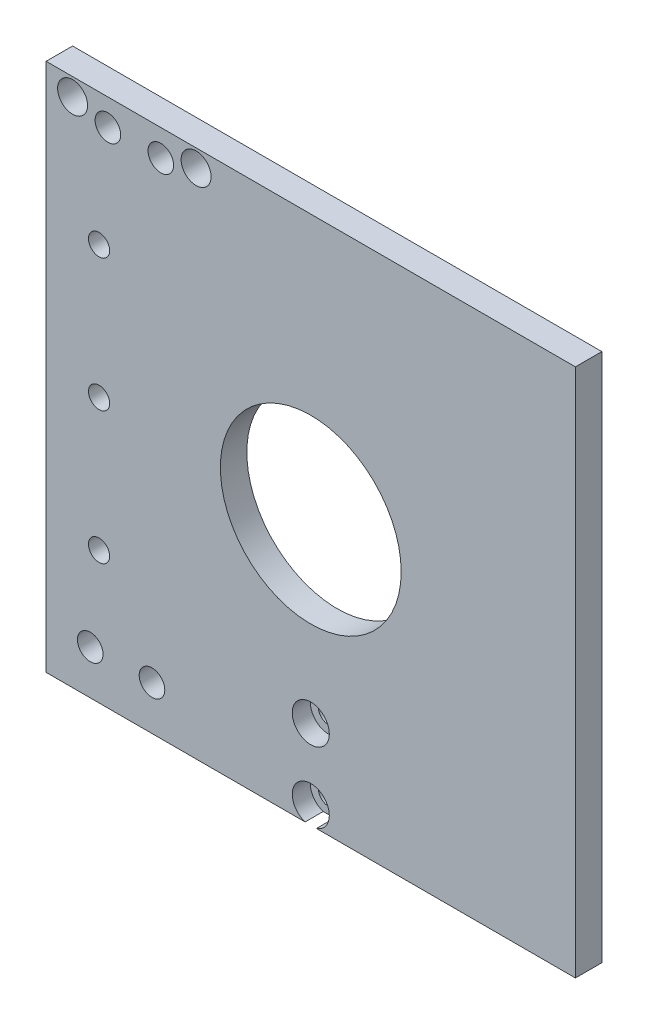
ISO-10303-21;
HEADER;
FILE_DESCRIPTION(('STEP AP214'),'2;1');
FILE_NAME('part.step','',(''),(''),'','','');
FILE_SCHEMA(('AUTOMOTIVE_DESIGN { 1 0 10303 214 1 1 1 1 }'));
ENDSEC;
DATA;
#1=APPLICATION_CONTEXT('core data for automotive mechanical design processes');
#2=APPLICATION_PROTOCOL_DEFINITION('international standard','automotive_design',2000,#1);
#3=PRODUCT_CONTEXT('',#1,'mechanical');
#4=PRODUCT('Part','Part','',(#3));
#5=PRODUCT_RELATED_PRODUCT_CATEGORY('part','',(#4));
#6=PRODUCT_DEFINITION_FORMATION('','',#4);
#7=PRODUCT_DEFINITION_CONTEXT('part definition',#1,'design');
#8=PRODUCT_DEFINITION('design','',#6,#7);
#9=PRODUCT_DEFINITION_SHAPE('','',#8);
#10=(LENGTH_UNIT() NAMED_UNIT(*) SI_UNIT(.MILLI.,.METRE.));
#11=(NAMED_UNIT(*) PLANE_ANGLE_UNIT() SI_UNIT($,.RADIAN.));
#12=(NAMED_UNIT(*) SI_UNIT($,.STERADIAN.) SOLID_ANGLE_UNIT());
#13=UNCERTAINTY_MEASURE_WITH_UNIT(LENGTH_MEASURE(1.E-05),#10,'distance_accuracy_value','');
#14=(GEOMETRIC_REPRESENTATION_CONTEXT(3) GLOBAL_UNCERTAINTY_ASSIGNED_CONTEXT((#13)) GLOBAL_UNIT_ASSIGNED_CONTEXT((#10,
#11,#12)) REPRESENTATION_CONTEXT('',''));
#15=CARTESIAN_POINT('',(0.,0.,0.));
#16=DIRECTION('',(0.,0.,1.));
#17=DIRECTION('',(1.,0.,0.));
#18=AXIS2_PLACEMENT_3D('',#15,#16,#17);
#19=CARTESIAN_POINT('',(1.11022302462516E-13,-20.,-0.01));
#20=DIRECTION('',(0.,0.,1.));
#21=DIRECTION('',(1.,0.,0.));
#22=AXIS2_PLACEMENT_3D('',#19,#20,#21);
#23=CYLINDRICAL_SURFACE('',#22,1.2);
#24=CARTESIAN_POINT('',(1.11022302462516E-13,-20.,0.));
#25=DIRECTION('',(0.,0.,1.));
#26=DIRECTION('',(1.,0.,0.));
#27=AXIS2_PLACEMENT_3D('',#24,#25,#26);
#28=CIRCLE('',#27,1.2);
#29=CARTESIAN_POINT('',(1.20000000000011,-20.,0.));
#30=VERTEX_POINT('',#29);
#31=EDGE_CURVE('E112',#30,#30,#28,.T.);
#32=ORIENTED_EDGE('',*,*,#31,.F.);
#33=EDGE_LOOP('',(#32));
#34=FACE_BOUND('',#33,.T.);
#35=CARTESIAN_POINT('',(1.11022302462516E-13,-20.,0.95));
#36=DIRECTION('',(0.,0.,1.));
#37=DIRECTION('',(1.,0.,0.));
#38=AXIS2_PLACEMENT_3D('',#35,#36,#37);
#39=CIRCLE('',#38,1.2);
#40=CARTESIAN_POINT('',(1.20000000000011,-20.,0.95));
#41=VERTEX_POINT('',#40);
#42=EDGE_CURVE('E161',#41,#41,#39,.F.);
#43=ORIENTED_EDGE('',*,*,#42,.F.);
#44=EDGE_LOOP('',(#43));
#45=FACE_BOUND('',#44,.T.);
#46=ADVANCED_FACE('F37',(#34,#45),#23,.F.);
#47=CARTESIAN_POINT('',(1.11022302462516E-13,-28.,-0.01));
#48=DIRECTION('',(0.,0.,1.));
#49=DIRECTION('',(1.,0.,0.));
#50=AXIS2_PLACEMENT_3D('',#47,#48,#49);
#51=CYLINDRICAL_SURFACE('',#50,1.2);
#52=CARTESIAN_POINT('',(1.11022302462516E-13,-28.,0.));
#53=DIRECTION('',(0.,0.,1.));
#54=DIRECTION('',(1.,0.,0.));
#55=AXIS2_PLACEMENT_3D('',#52,#53,#54);
#56=CIRCLE('',#55,1.2);
#57=CARTESIAN_POINT('',(1.20000000000011,-28.,0.));
#58=VERTEX_POINT('',#57);
#59=EDGE_CURVE('E156',#58,#58,#56,.T.);
#60=ORIENTED_EDGE('',*,*,#59,.F.);
#61=EDGE_LOOP('',(#60));
#62=FACE_BOUND('',#61,.T.);
#63=CARTESIAN_POINT('',(1.11022302462516E-13,-28.,0.95));
#64=DIRECTION('',(0.,0.,1.));
#65=DIRECTION('',(1.,0.,0.));
#66=AXIS2_PLACEMENT_3D('',#63,#64,#65);
#67=CIRCLE('',#66,1.2);
#68=CARTESIAN_POINT('',(1.20000000000011,-28.,0.95));
#69=VERTEX_POINT('',#68);
#70=EDGE_CURVE('E164',#69,#69,#67,.F.);
#71=ORIENTED_EDGE('',*,*,#70,.F.);
#72=EDGE_LOOP('',(#71));
#73=FACE_BOUND('',#72,.T.);
#74=ADVANCED_FACE('F244',(#62,#73),#51,.F.);
#75=CARTESIAN_POINT('',(-30.,-30.,3.));
#76=DIRECTION('',(1.,0.,0.));
#77=DIRECTION('',(0.,0.,-1.));
#78=AXIS2_PLACEMENT_3D('',#75,#76,#77);
#79=PLANE('',#78);
#80=DIRECTION('',(0.,-1.,0.));
#81=VECTOR('',#80,1.);
#82=CARTESIAN_POINT('',(-30.,-30.,0.));
#83=LINE('',#82,#81);
#84=CARTESIAN_POINT('',(-30.,30.,0.));
#85=VERTEX_POINT('',#84);
#86=CARTESIAN_POINT('',(-30.,-30.,0.));
#87=VERTEX_POINT('',#86);
#88=EDGE_CURVE('E132',#85,#87,#83,.T.);
#89=ORIENTED_EDGE('',*,*,#88,.T.);
#90=DIRECTION('',(0.,0.,-1.));
#91=VECTOR('',#90,1.);
#92=CARTESIAN_POINT('',(-30.,-30.,3.));
#93=LINE('',#92,#91);
#94=CARTESIAN_POINT('',(-30.,-30.,3.));
#95=VERTEX_POINT('',#94);
#96=EDGE_CURVE('E11',#95,#87,#93,.T.);
#97=ORIENTED_EDGE('',*,*,#96,.F.);
#98=DIRECTION('',(0.,-1.,0.));
#99=VECTOR('',#98,1.);
#100=CARTESIAN_POINT('',(-30.,-30.,3.));
#101=LINE('',#100,#99);
#102=CARTESIAN_POINT('',(-30.,30.,3.));
#103=VERTEX_POINT('',#102);
#104=EDGE_CURVE('E119',#103,#95,#101,.T.);
#105=ORIENTED_EDGE('',*,*,#104,.F.);
#106=DIRECTION('',(0.,0.,-1.));
#107=VECTOR('',#106,1.);
#108=CARTESIAN_POINT('',(-30.,30.,3.));
#109=LINE('',#108,#107);
#110=EDGE_CURVE('E129',#103,#85,#109,.T.);
#111=ORIENTED_EDGE('',*,*,#110,.T.);
#112=EDGE_LOOP('',(#89,#97,#105,#111));
#113=FACE_BOUND('',#112,.T.);
#114=ADVANCED_FACE('F45',(#113),#79,.F.);
#115=CARTESIAN_POINT('',(30.,-30.,3.));
#116=DIRECTION('',(0.,1.,0.));
#117=DIRECTION('',(-1.,0.,0.));
#118=AXIS2_PLACEMENT_3D('',#115,#116,#117);
#119=PLANE('',#118);
#120=DIRECTION('',(1.,0.,0.));
#121=VECTOR('',#120,1.);
#122=CARTESIAN_POINT('',(30.,-30.,0.95));
#123=LINE('',#122,#121);
#124=CARTESIAN_POINT('',(-0.640312423743276,-30.,0.95));
#125=VERTEX_POINT('',#124);
#126=CARTESIAN_POINT('',(0.640312423743498,-30.,0.95));
#127=VERTEX_POINT('',#126);
#128=EDGE_CURVE('E114',#125,#127,#123,.T.);
#129=ORIENTED_EDGE('',*,*,#128,.F.);
#130=DIRECTION('',(0.,0.,1.));
#131=VECTOR('',#130,1.);
#132=CARTESIAN_POINT('',(-0.640312423743276,-30.,0.95));
#133=LINE('',#132,#131);
#134=CARTESIAN_POINT('',(-0.640312423743276,-30.,3.));
#135=VERTEX_POINT('',#134);
#136=EDGE_CURVE('E108',#125,#135,#133,.T.);
#137=ORIENTED_EDGE('',*,*,#136,.T.);
#138=DIRECTION('',(1.,0.,0.));
#139=VECTOR('',#138,1.);
#140=CARTESIAN_POINT('',(30.,-30.,3.));
#141=LINE('',#140,#139);
#142=EDGE_CURVE('E94',#95,#135,#141,.T.);
#143=ORIENTED_EDGE('',*,*,#142,.F.);
#144=ORIENTED_EDGE('',*,*,#96,.T.);
#145=DIRECTION('',(1.,0.,0.));
#146=VECTOR('',#145,1.);
#147=CARTESIAN_POINT('',(30.,-30.,0.));
#148=LINE('',#147,#146);
#149=CARTESIAN_POINT('',(30.,-30.,0.));
#150=VERTEX_POINT('',#149);
#151=EDGE_CURVE('E131',#87,#150,#148,.T.);
#152=ORIENTED_EDGE('',*,*,#151,.T.);
#153=DIRECTION('',(0.,0.,-1.));
#154=VECTOR('',#153,1.);
#155=CARTESIAN_POINT('',(30.,-30.,3.));
#156=LINE('',#155,#154);
#157=CARTESIAN_POINT('',(30.,-30.,3.));
#158=VERTEX_POINT('',#157);
#159=EDGE_CURVE('E47',#158,#150,#156,.T.);
#160=ORIENTED_EDGE('',*,*,#159,.F.);
#161=CARTESIAN_POINT('',(0.640312423743498,-30.,3.));
#162=VERTEX_POINT('',#161);
#163=EDGE_CURVE('E123',#162,#158,#141,.T.);
#164=ORIENTED_EDGE('',*,*,#163,.F.);
#165=DIRECTION('',(0.,0.,1.));
#166=VECTOR('',#165,1.);
#167=CARTESIAN_POINT('',(0.640312423743498,-30.,0.95));
#168=LINE('',#167,#166);
#169=EDGE_CURVE('E110',#162,#127,#168,.F.);
#170=ORIENTED_EDGE('',*,*,#169,.T.);
#171=EDGE_LOOP('',(#129,#137,#143,#144,#152,#160,#164,#170));
#172=FACE_BOUND('',#171,.T.);
#173=ADVANCED_FACE('F111',(#172),#119,.F.);
#174=CARTESIAN_POINT('',(30.,-30.,3.));
#175=DIRECTION('',(-1.,0.,0.));
#176=DIRECTION('',(0.,0.,1.));
#177=AXIS2_PLACEMENT_3D('',#174,#175,#176);
#178=PLANE('',#177);
#179=DIRECTION('',(0.,1.,0.));
#180=VECTOR('',#179,1.);
#181=CARTESIAN_POINT('',(30.,-30.,0.));
#182=LINE('',#181,#180);
#183=CARTESIAN_POINT('',(30.,30.,0.));
#184=VERTEX_POINT('',#183);
#185=EDGE_CURVE('E139',#150,#184,#182,.T.);
#186=ORIENTED_EDGE('',*,*,#185,.T.);
#187=DIRECTION('',(0.,0.,-1.));
#188=VECTOR('',#187,1.);
#189=CARTESIAN_POINT('',(30.,30.,3.));
#190=LINE('',#189,#188);
#191=CARTESIAN_POINT('',(30.,30.,3.));
#192=VERTEX_POINT('',#191);
#193=EDGE_CURVE('E142',#192,#184,#190,.T.);
#194=ORIENTED_EDGE('',*,*,#193,.F.);
#195=DIRECTION('',(0.,1.,0.));
#196=VECTOR('',#195,1.);
#197=CARTESIAN_POINT('',(30.,-30.,3.));
#198=LINE('',#197,#196);
#199=EDGE_CURVE('E125',#158,#192,#198,.T.);
#200=ORIENTED_EDGE('',*,*,#199,.F.);
#201=ORIENTED_EDGE('',*,*,#159,.T.);
#202=EDGE_LOOP('',(#186,#194,#200,#201));
#203=FACE_BOUND('',#202,.T.);
#204=ADVANCED_FACE('F237',(#203),#178,.F.);
#205=CARTESIAN_POINT('',(30.,30.,3.));
#206=DIRECTION('',(0.,-1.,0.));
#207=DIRECTION('',(1.,0.,0.));
#208=AXIS2_PLACEMENT_3D('',#205,#206,#207);
#209=PLANE('',#208);
#210=DIRECTION('',(-1.,0.,0.));
#211=VECTOR('',#210,1.);
#212=CARTESIAN_POINT('',(30.,30.,0.));
#213=LINE('',#212,#211);
#214=EDGE_CURVE('E88',#184,#85,#213,.T.);
#215=ORIENTED_EDGE('',*,*,#214,.T.);
#216=ORIENTED_EDGE('',*,*,#110,.F.);
#217=DIRECTION('',(-1.,0.,0.));
#218=VECTOR('',#217,1.);
#219=CARTESIAN_POINT('',(30.,30.,3.));
#220=LINE('',#219,#218);
#221=EDGE_CURVE('E61',#192,#103,#220,.T.);
#222=ORIENTED_EDGE('',*,*,#221,.F.);
#223=ORIENTED_EDGE('',*,*,#193,.T.);
#224=EDGE_LOOP('',(#215,#216,#222,#223));
#225=FACE_BOUND('',#224,.T.);
#226=ADVANCED_FACE('F226',(#225),#209,.F.);
#227=CARTESIAN_POINT('',(0.,0.,3.));
#228=DIRECTION('',(0.,0.,1.));
#229=DIRECTION('',(1.,0.,0.));
#230=AXIS2_PLACEMENT_3D('',#227,#228,#229);
#231=PLANE('',#230);
#232=CARTESIAN_POINT('',(-27.,28.,3.));
#233=DIRECTION('',(0.,0.,1.));
#234=DIRECTION('',(1.,0.,0.));
#235=AXIS2_PLACEMENT_3D('',#232,#233,#234);
#236=CIRCLE('',#235,1.7);
#237=CARTESIAN_POINT('',(-25.3,28.,3.));
#238=VERTEX_POINT('',#237);
#239=EDGE_CURVE('E166',#238,#238,#236,.T.);
#240=ORIENTED_EDGE('',*,*,#239,.F.);
#241=EDGE_LOOP('',(#240));
#242=FACE_BOUND('',#241,.T.);
#243=CARTESIAN_POINT('',(-13.,28.,3.));
#244=DIRECTION('',(0.,0.,1.));
#245=DIRECTION('',(1.,0.,0.));
#246=AXIS2_PLACEMENT_3D('',#243,#244,#245);
#247=CIRCLE('',#246,1.7);
#248=CARTESIAN_POINT('',(-11.3,28.,3.));
#249=VERTEX_POINT('',#248);
#250=EDGE_CURVE('E174',#249,#249,#247,.T.);
#251=ORIENTED_EDGE('',*,*,#250,.F.);
#252=EDGE_LOOP('',(#251));
#253=FACE_BOUND('',#252,.T.);
#254=CARTESIAN_POINT('',(1.11022302462516E-13,-28.,3.));
#255=DIRECTION('',(0.,0.,1.));
#256=DIRECTION('',(1.,0.,0.));
#257=AXIS2_PLACEMENT_3D('',#254,#255,#256);
#258=CIRCLE('',#257,2.1);
#259=EDGE_CURVE('E101',#162,#135,#258,.T.);
#260=ORIENTED_EDGE('',*,*,#259,.F.);
#261=ORIENTED_EDGE('',*,*,#163,.T.);
#262=ORIENTED_EDGE('',*,*,#199,.T.);
#263=ORIENTED_EDGE('',*,*,#221,.T.);
#264=ORIENTED_EDGE('',*,*,#104,.T.);
#265=ORIENTED_EDGE('',*,*,#142,.T.);
#266=EDGE_LOOP('',(#260,#261,#262,#263,#264,#265));
#267=FACE_BOUND('',#266,.T.);
#268=CARTESIAN_POINT('',(1.11022302462516E-13,-20.,3.));
#269=DIRECTION('',(0.,0.,1.));
#270=DIRECTION('',(1.,0.,0.));
#271=AXIS2_PLACEMENT_3D('',#268,#269,#270);
#272=CIRCLE('',#271,2.1);
#273=CARTESIAN_POINT('',(2.10000000000011,-20.,3.));
#274=VERTEX_POINT('',#273);
#275=EDGE_CURVE('E113',#274,#274,#272,.T.);
#276=ORIENTED_EDGE('',*,*,#275,.F.);
#277=EDGE_LOOP('',(#276));
#278=FACE_BOUND('',#277,.T.);
#279=CARTESIAN_POINT('',(-24.0000000000001,-15.0000000000001,3.));
#280=DIRECTION('',(0.,0.,1.));
#281=DIRECTION('',(1.,0.,0.));
#282=AXIS2_PLACEMENT_3D('',#279,#280,#281);
#283=CIRCLE('',#282,1.2);
#284=CARTESIAN_POINT('',(-22.8000000000001,-15.0000000000001,3.));
#285=VERTEX_POINT('',#284);
#286=EDGE_CURVE('E148',#285,#285,#283,.T.);
#287=ORIENTED_EDGE('',*,*,#286,.F.);
#288=EDGE_LOOP('',(#287));
#289=FACE_BOUND('',#288,.T.);
#290=CARTESIAN_POINT('',(-24.0000000000001,0.,3.));
#291=DIRECTION('',(0.,0.,1.));
#292=DIRECTION('',(1.,0.,0.));
#293=AXIS2_PLACEMENT_3D('',#290,#291,#292);
#294=CIRCLE('',#293,1.2);
#295=CARTESIAN_POINT('',(-22.8000000000001,0.,3.));
#296=VERTEX_POINT('',#295);
#297=EDGE_CURVE('E191',#296,#296,#294,.T.);
#298=ORIENTED_EDGE('',*,*,#297,.F.);
#299=EDGE_LOOP('',(#298));
#300=FACE_BOUND('',#299,.T.);
#301=CARTESIAN_POINT('',(-24.0000000000001,14.9999999999999,3.));
#302=DIRECTION('',(0.,0.,1.));
#303=DIRECTION('',(1.,0.,0.));
#304=AXIS2_PLACEMENT_3D('',#301,#302,#303);
#305=CIRCLE('',#304,1.2);
#306=CARTESIAN_POINT('',(-22.8000000000001,14.9999999999999,3.));
#307=VERTEX_POINT('',#306);
#308=EDGE_CURVE('E163',#307,#307,#305,.T.);
#309=ORIENTED_EDGE('',*,*,#308,.F.);
#310=EDGE_LOOP('',(#309));
#311=FACE_BOUND('',#310,.T.);
#312=CARTESIAN_POINT('',(-17.,27.,3.));
#313=DIRECTION('',(0.,0.,-1.));
#314=DIRECTION('',(-1.,0.,0.));
#315=AXIS2_PLACEMENT_3D('',#312,#313,#314);
#316=CIRCLE('',#315,1.45);
#317=CARTESIAN_POINT('',(-18.45,27.,3.));
#318=VERTEX_POINT('',#317);
#319=EDGE_CURVE('E196',#318,#318,#316,.T.);
#320=ORIENTED_EDGE('',*,*,#319,.T.);
#321=EDGE_LOOP('',(#320));
#322=FACE_BOUND('',#321,.T.);
#323=CARTESIAN_POINT('',(-23.,27.,3.));
#324=DIRECTION('',(0.,0.,-1.));
#325=DIRECTION('',(-1.,0.,0.));
#326=AXIS2_PLACEMENT_3D('',#323,#324,#325);
#327=CIRCLE('',#326,1.45);
#328=CARTESIAN_POINT('',(-24.45,27.,3.));
#329=VERTEX_POINT('',#328);
#330=EDGE_CURVE('E154',#329,#329,#327,.T.);
#331=ORIENTED_EDGE('',*,*,#330,.T.);
#332=EDGE_LOOP('',(#331));
#333=FACE_BOUND('',#332,.T.);
#334=CARTESIAN_POINT('',(-17.9999999999999,-24.9999999999999,3.));
#335=DIRECTION('',(0.,0.,1.));
#336=DIRECTION('',(1.,0.,0.));
#337=AXIS2_PLACEMENT_3D('',#334,#335,#336);
#338=CIRCLE('',#337,1.45);
#339=CARTESIAN_POINT('',(-16.5499999999999,-24.9999999999999,3.));
#340=VERTEX_POINT('',#339);
#341=EDGE_CURVE('E217',#340,#340,#338,.T.);
#342=ORIENTED_EDGE('',*,*,#341,.F.);
#343=EDGE_LOOP('',(#342));
#344=FACE_BOUND('',#343,.T.);
#345=CARTESIAN_POINT('',(-24.9999999999999,-24.9999999999999,3.));
#346=DIRECTION('',(0.,0.,1.));
#347=DIRECTION('',(1.,0.,0.));
#348=AXIS2_PLACEMENT_3D('',#345,#346,#347);
#349=CIRCLE('',#348,1.45);
#350=CARTESIAN_POINT('',(-23.5499999999999,-24.9999999999999,3.));
#351=VERTEX_POINT('',#350);
#352=EDGE_CURVE('E213',#351,#351,#349,.T.);
#353=ORIENTED_EDGE('',*,*,#352,.F.);
#354=EDGE_LOOP('',(#353));
#355=FACE_BOUND('',#354,.T.);
#356=CARTESIAN_POINT('',(0.,0.,3.));
#357=DIRECTION('',(0.,0.,1.));
#358=DIRECTION('',(1.,0.,0.));
#359=AXIS2_PLACEMENT_3D('',#356,#357,#358);
#360=CIRCLE('',#359,10.25);
#361=CARTESIAN_POINT('',(10.25,0.,3.));
#362=VERTEX_POINT('',#361);
#363=EDGE_CURVE('E216',#362,#362,#360,.T.);
#364=ORIENTED_EDGE('',*,*,#363,.F.);
#365=EDGE_LOOP('',(#364));
#366=FACE_BOUND('',#365,.T.);
#367=ADVANCED_FACE('F120',(#242,#253,#267,#278,#289,#300,#311,#322,#333,#344,#355,#366),#231,.T.);
#368=CARTESIAN_POINT('',(0.,0.,0.));
#369=DIRECTION('',(0.,0.,1.));
#370=DIRECTION('',(1.,0.,0.));
#371=AXIS2_PLACEMENT_3D('',#368,#369,#370);
#372=PLANE('',#371);
#373=CARTESIAN_POINT('',(-27.,28.,0.));
#374=DIRECTION('',(0.,0.,1.));
#375=DIRECTION('',(1.,0.,0.));
#376=AXIS2_PLACEMENT_3D('',#373,#374,#375);
#377=CIRCLE('',#376,1.7);
#378=CARTESIAN_POINT('',(-25.3,28.,0.));
#379=VERTEX_POINT('',#378);
#380=EDGE_CURVE('E42',#379,#379,#377,.T.);
#381=ORIENTED_EDGE('',*,*,#380,.T.);
#382=EDGE_LOOP('',(#381));
#383=FACE_BOUND('',#382,.T.);
#384=CARTESIAN_POINT('',(-13.,28.,0.));
#385=DIRECTION('',(0.,0.,1.));
#386=DIRECTION('',(1.,0.,0.));
#387=AXIS2_PLACEMENT_3D('',#384,#385,#386);
#388=CIRCLE('',#387,1.7);
#389=CARTESIAN_POINT('',(-11.3,28.,0.));
#390=VERTEX_POINT('',#389);
#391=EDGE_CURVE('E170',#390,#390,#388,.T.);
#392=ORIENTED_EDGE('',*,*,#391,.T.);
#393=EDGE_LOOP('',(#392));
#394=FACE_BOUND('',#393,.T.);
#395=ORIENTED_EDGE('',*,*,#59,.T.);
#396=EDGE_LOOP('',(#395));
#397=FACE_BOUND('',#396,.T.);
#398=ORIENTED_EDGE('',*,*,#31,.T.);
#399=EDGE_LOOP('',(#398));
#400=FACE_BOUND('',#399,.T.);
#401=CARTESIAN_POINT('',(-24.0000000000001,-15.0000000000001,0.));
#402=DIRECTION('',(0.,0.,1.));
#403=DIRECTION('',(1.,0.,0.));
#404=AXIS2_PLACEMENT_3D('',#401,#402,#403);
#405=CIRCLE('',#404,1.2);
#406=CARTESIAN_POINT('',(-22.8000000000001,-15.0000000000001,0.));
#407=VERTEX_POINT('',#406);
#408=EDGE_CURVE('E155',#407,#407,#405,.T.);
#409=ORIENTED_EDGE('',*,*,#408,.T.);
#410=EDGE_LOOP('',(#409));
#411=FACE_BOUND('',#410,.T.);
#412=CARTESIAN_POINT('',(-24.0000000000001,0.,0.));
#413=DIRECTION('',(0.,0.,1.));
#414=DIRECTION('',(1.,0.,0.));
#415=AXIS2_PLACEMENT_3D('',#412,#413,#414);
#416=CIRCLE('',#415,1.2);
#417=CARTESIAN_POINT('',(-22.8000000000001,0.,0.));
#418=VERTEX_POINT('',#417);
#419=EDGE_CURVE('E147',#418,#418,#416,.T.);
#420=ORIENTED_EDGE('',*,*,#419,.T.);
#421=EDGE_LOOP('',(#420));
#422=FACE_BOUND('',#421,.T.);
#423=CARTESIAN_POINT('',(-24.0000000000001,14.9999999999999,0.));
#424=DIRECTION('',(0.,0.,1.));
#425=DIRECTION('',(1.,0.,0.));
#426=AXIS2_PLACEMENT_3D('',#423,#424,#425);
#427=CIRCLE('',#426,1.2);
#428=CARTESIAN_POINT('',(-22.8000000000001,14.9999999999999,0.));
#429=VERTEX_POINT('',#428);
#430=EDGE_CURVE('E143',#429,#429,#427,.T.);
#431=ORIENTED_EDGE('',*,*,#430,.T.);
#432=EDGE_LOOP('',(#431));
#433=FACE_BOUND('',#432,.T.);
#434=CARTESIAN_POINT('',(-17.,27.,0.));
#435=DIRECTION('',(0.,0.,-1.));
#436=DIRECTION('',(-1.,0.,0.));
#437=AXIS2_PLACEMENT_3D('',#434,#435,#436);
#438=CIRCLE('',#437,1.45);
#439=CARTESIAN_POINT('',(-18.45,27.,0.));
#440=VERTEX_POINT('',#439);
#441=EDGE_CURVE('E199',#440,#440,#438,.T.);
#442=ORIENTED_EDGE('',*,*,#441,.F.);
#443=EDGE_LOOP('',(#442));
#444=FACE_BOUND('',#443,.T.);
#445=CARTESIAN_POINT('',(-23.,27.,0.));
#446=DIRECTION('',(0.,0.,-1.));
#447=DIRECTION('',(-1.,0.,0.));
#448=AXIS2_PLACEMENT_3D('',#445,#446,#447);
#449=CIRCLE('',#448,1.45);
#450=CARTESIAN_POINT('',(-24.45,27.,0.));
#451=VERTEX_POINT('',#450);
#452=EDGE_CURVE('E202',#451,#451,#449,.T.);
#453=ORIENTED_EDGE('',*,*,#452,.F.);
#454=EDGE_LOOP('',(#453));
#455=FACE_BOUND('',#454,.T.);
#456=CARTESIAN_POINT('',(-17.9999999999999,-24.9999999999999,0.));
#457=DIRECTION('',(0.,0.,-1.));
#458=DIRECTION('',(-1.,0.,0.));
#459=AXIS2_PLACEMENT_3D('',#456,#457,#458);
#460=CIRCLE('',#459,1.45);
#461=CARTESIAN_POINT('',(-19.4499999999999,-24.9999999999999,0.));
#462=VERTEX_POINT('',#461);
#463=EDGE_CURVE('E209',#462,#462,#460,.T.);
#464=ORIENTED_EDGE('',*,*,#463,.F.);
#465=EDGE_LOOP('',(#464));
#466=FACE_BOUND('',#465,.T.);
#467=CARTESIAN_POINT('',(-24.9999999999999,-24.9999999999999,0.));
#468=DIRECTION('',(0.,0.,-1.));
#469=DIRECTION('',(-1.,0.,0.));
#470=AXIS2_PLACEMENT_3D('',#467,#468,#469);
#471=CIRCLE('',#470,1.45);
#472=CARTESIAN_POINT('',(-26.4499999999999,-24.9999999999999,0.));
#473=VERTEX_POINT('',#472);
#474=EDGE_CURVE('E197',#473,#473,#471,.T.);
#475=ORIENTED_EDGE('',*,*,#474,.F.);
#476=EDGE_LOOP('',(#475));
#477=FACE_BOUND('',#476,.T.);
#478=CARTESIAN_POINT('',(0.,0.,0.));
#479=DIRECTION('',(0.,0.,1.));
#480=DIRECTION('',(1.,0.,0.));
#481=AXIS2_PLACEMENT_3D('',#478,#479,#480);
#482=CIRCLE('',#481,10.25);
#483=CARTESIAN_POINT('',(10.25,0.,0.));
#484=VERTEX_POINT('',#483);
#485=EDGE_CURVE('E133',#484,#484,#482,.T.);
#486=ORIENTED_EDGE('',*,*,#485,.T.);
#487=EDGE_LOOP('',(#486));
#488=FACE_BOUND('',#487,.T.);
#489=ORIENTED_EDGE('',*,*,#88,.F.);
#490=ORIENTED_EDGE('',*,*,#214,.F.);
#491=ORIENTED_EDGE('',*,*,#185,.F.);
#492=ORIENTED_EDGE('',*,*,#151,.F.);
#493=EDGE_LOOP('',(#489,#490,#491,#492));
#494=FACE_BOUND('',#493,.T.);
#495=ADVANCED_FACE('F230',(#383,#394,#397,#400,#411,#422,#433,#444,#455,#466,#477,#488,#494),
#372,.F.);
#496=CARTESIAN_POINT('',(0.,0.,0.));
#497=DIRECTION('',(0.,0.,1.));
#498=DIRECTION('',(1.,0.,0.));
#499=AXIS2_PLACEMENT_3D('',#496,#497,#498);
#500=CYLINDRICAL_SURFACE('',#499,10.25);
#501=ORIENTED_EDGE('',*,*,#485,.F.);
#502=EDGE_LOOP('',(#501));
#503=FACE_BOUND('',#502,.T.);
#504=ORIENTED_EDGE('',*,*,#363,.T.);
#505=EDGE_LOOP('',(#504));
#506=FACE_BOUND('',#505,.T.);
#507=ADVANCED_FACE('F223',(#503,#506),#500,.F.);
#508=CARTESIAN_POINT('',(-24.9999999999999,-24.9999999999999,3.01));
#509=DIRECTION('',(0.,0.,-1.));
#510=DIRECTION('',(-1.,0.,0.));
#511=AXIS2_PLACEMENT_3D('',#508,#509,#510);
#512=CYLINDRICAL_SURFACE('',#511,1.45);
#513=ORIENTED_EDGE('',*,*,#352,.T.);
#514=EDGE_LOOP('',(#513));
#515=FACE_BOUND('',#514,.T.);
#516=ORIENTED_EDGE('',*,*,#474,.T.);
#517=EDGE_LOOP('',(#516));
#518=FACE_BOUND('',#517,.T.);
#519=ADVANCED_FACE('F277',(#515,#518),#512,.F.);
#520=CARTESIAN_POINT('',(-17.9999999999999,-24.9999999999999,3.01));
#521=DIRECTION('',(0.,0.,-1.));
#522=DIRECTION('',(-1.,0.,0.));
#523=AXIS2_PLACEMENT_3D('',#520,#521,#522);
#524=CYLINDRICAL_SURFACE('',#523,1.45);
#525=ORIENTED_EDGE('',*,*,#341,.T.);
#526=EDGE_LOOP('',(#525));
#527=FACE_BOUND('',#526,.T.);
#528=ORIENTED_EDGE('',*,*,#463,.T.);
#529=EDGE_LOOP('',(#528));
#530=FACE_BOUND('',#529,.T.);
#531=ADVANCED_FACE('F272',(#527,#530),#524,.F.);
#532=CARTESIAN_POINT('',(-23.,27.,3.));
#533=DIRECTION('',(0.,0.,-1.));
#534=DIRECTION('',(-1.,0.,0.));
#535=AXIS2_PLACEMENT_3D('',#532,#533,#534);
#536=CYLINDRICAL_SURFACE('',#535,1.45);
#537=ORIENTED_EDGE('',*,*,#330,.F.);
#538=EDGE_LOOP('',(#537));
#539=FACE_BOUND('',#538,.T.);
#540=ORIENTED_EDGE('',*,*,#452,.T.);
#541=EDGE_LOOP('',(#540));
#542=FACE_BOUND('',#541,.T.);
#543=ADVANCED_FACE('F269',(#539,#542),#536,.F.);
#544=CARTESIAN_POINT('',(-17.,27.,3.));
#545=DIRECTION('',(0.,0.,-1.));
#546=DIRECTION('',(-1.,0.,0.));
#547=AXIS2_PLACEMENT_3D('',#544,#545,#546);
#548=CYLINDRICAL_SURFACE('',#547,1.45);
#549=ORIENTED_EDGE('',*,*,#319,.F.);
#550=EDGE_LOOP('',(#549));
#551=FACE_BOUND('',#550,.T.);
#552=ORIENTED_EDGE('',*,*,#441,.T.);
#553=EDGE_LOOP('',(#552));
#554=FACE_BOUND('',#553,.T.);
#555=ADVANCED_FACE('F266',(#551,#554),#548,.F.);
#556=CARTESIAN_POINT('',(-24.0000000000001,14.9999999999999,-0.01));
#557=DIRECTION('',(0.,0.,1.));
#558=DIRECTION('',(1.,0.,0.));
#559=AXIS2_PLACEMENT_3D('',#556,#557,#558);
#560=CYLINDRICAL_SURFACE('',#559,1.2);
#561=ORIENTED_EDGE('',*,*,#308,.T.);
#562=EDGE_LOOP('',(#561));
#563=FACE_BOUND('',#562,.T.);
#564=ORIENTED_EDGE('',*,*,#430,.F.);
#565=EDGE_LOOP('',(#564));
#566=FACE_BOUND('',#565,.T.);
#567=ADVANCED_FACE('F265',(#563,#566),#560,.F.);
#568=CARTESIAN_POINT('',(-24.0000000000001,0.,-0.01));
#569=DIRECTION('',(0.,0.,1.));
#570=DIRECTION('',(1.,0.,0.));
#571=AXIS2_PLACEMENT_3D('',#568,#569,#570);
#572=CYLINDRICAL_SURFACE('',#571,1.2);
#573=ORIENTED_EDGE('',*,*,#297,.T.);
#574=EDGE_LOOP('',(#573));
#575=FACE_BOUND('',#574,.T.);
#576=ORIENTED_EDGE('',*,*,#419,.F.);
#577=EDGE_LOOP('',(#576));
#578=FACE_BOUND('',#577,.T.);
#579=ADVANCED_FACE('F256',(#575,#578),#572,.F.);
#580=CARTESIAN_POINT('',(-24.0000000000001,-15.0000000000001,-0.01));
#581=DIRECTION('',(0.,0.,1.));
#582=DIRECTION('',(1.,0.,0.));
#583=AXIS2_PLACEMENT_3D('',#580,#581,#582);
#584=CYLINDRICAL_SURFACE('',#583,1.2);
#585=ORIENTED_EDGE('',*,*,#286,.T.);
#586=EDGE_LOOP('',(#585));
#587=FACE_BOUND('',#586,.T.);
#588=ORIENTED_EDGE('',*,*,#408,.F.);
#589=EDGE_LOOP('',(#588));
#590=FACE_BOUND('',#589,.T.);
#591=ADVANCED_FACE('F258',(#587,#590),#584,.F.);
#592=CARTESIAN_POINT('',(1.11022302462516E-13,-28.,0.95));
#593=DIRECTION('',(0.,0.,1.));
#594=DIRECTION('',(1.,0.,0.));
#595=AXIS2_PLACEMENT_3D('',#592,#593,#594);
#596=CYLINDRICAL_SURFACE('',#595,2.1);
#597=CARTESIAN_POINT('',(1.11022302462516E-13,-28.,0.95));
#598=DIRECTION('',(0.,0.,1.));
#599=DIRECTION('',(1.,0.,0.));
#600=AXIS2_PLACEMENT_3D('',#597,#598,#599);
#601=CIRCLE('',#600,2.1);
#602=EDGE_CURVE('E57',#127,#125,#601,.T.);
#603=ORIENTED_EDGE('',*,*,#602,.F.);
#604=ORIENTED_EDGE('',*,*,#169,.F.);
#605=ORIENTED_EDGE('',*,*,#259,.T.);
#606=ORIENTED_EDGE('',*,*,#136,.F.);
#607=EDGE_LOOP('',(#603,#604,#605,#606));
#608=FACE_BOUND('',#607,.T.);
#609=ADVANCED_FACE('F103',(#608),#596,.F.);
#610=CARTESIAN_POINT('',(1.11022302462516E-13,-28.,0.95));
#611=DIRECTION('',(0.,0.,1.));
#612=DIRECTION('',(1.,0.,0.));
#613=AXIS2_PLACEMENT_3D('',#610,#611,#612);
#614=PLANE('',#613);
#615=ORIENTED_EDGE('',*,*,#70,.T.);
#616=EDGE_LOOP('',(#615));
#617=FACE_BOUND('',#616,.T.);
#618=ORIENTED_EDGE('',*,*,#128,.T.);
#619=ORIENTED_EDGE('',*,*,#602,.T.);
#620=EDGE_LOOP('',(#618,#619));
#621=FACE_BOUND('',#620,.T.);
#622=ADVANCED_FACE('F396',(#617,#621),#614,.T.);
#623=CARTESIAN_POINT('',(1.11022302462516E-13,-20.,0.95));
#624=DIRECTION('',(0.,0.,1.));
#625=DIRECTION('',(1.,0.,0.));
#626=AXIS2_PLACEMENT_3D('',#623,#624,#625);
#627=PLANE('',#626);
#628=CARTESIAN_POINT('',(1.11022302462516E-13,-20.,0.95));
#629=DIRECTION('',(0.,0.,1.));
#630=DIRECTION('',(1.,0.,0.));
#631=AXIS2_PLACEMENT_3D('',#628,#629,#630);
#632=CIRCLE('',#631,2.1);
#633=CARTESIAN_POINT('',(2.10000000000011,-20.,0.95));
#634=VERTEX_POINT('',#633);
#635=EDGE_CURVE('E172',#634,#634,#632,.T.);
#636=ORIENTED_EDGE('',*,*,#635,.T.);
#637=EDGE_LOOP('',(#636));
#638=FACE_BOUND('',#637,.T.);
#639=ORIENTED_EDGE('',*,*,#42,.T.);
#640=EDGE_LOOP('',(#639));
#641=FACE_BOUND('',#640,.T.);
#642=ADVANCED_FACE('F403',(#638,#641),#627,.T.);
#643=CARTESIAN_POINT('',(1.11022302462516E-13,-20.,0.95));
#644=DIRECTION('',(0.,0.,1.));
#645=DIRECTION('',(1.,0.,0.));
#646=AXIS2_PLACEMENT_3D('',#643,#644,#645);
#647=CYLINDRICAL_SURFACE('',#646,2.1);
#648=ORIENTED_EDGE('',*,*,#635,.F.);
#649=EDGE_LOOP('',(#648));
#650=FACE_BOUND('',#649,.T.);
#651=ORIENTED_EDGE('',*,*,#275,.T.);
#652=EDGE_LOOP('',(#651));
#653=FACE_BOUND('',#652,.T.);
#654=ADVANCED_FACE('F412',(#650,#653),#647,.F.);
#655=CARTESIAN_POINT('',(-13.,28.,-0.5));
#656=DIRECTION('',(0.,0.,1.));
#657=DIRECTION('',(1.,0.,0.));
#658=AXIS2_PLACEMENT_3D('',#655,#656,#657);
#659=CYLINDRICAL_SURFACE('',#658,1.7);
#660=ORIENTED_EDGE('',*,*,#250,.T.);
#661=EDGE_LOOP('',(#660));
#662=FACE_BOUND('',#661,.T.);
#663=ORIENTED_EDGE('',*,*,#391,.F.);
#664=EDGE_LOOP('',(#663));
#665=FACE_BOUND('',#664,.T.);
#666=ADVANCED_FACE('F423',(#662,#665),#659,.F.);
#667=CARTESIAN_POINT('',(-27.,28.,-0.5));
#668=DIRECTION('',(0.,0.,1.));
#669=DIRECTION('',(1.,0.,0.));
#670=AXIS2_PLACEMENT_3D('',#667,#668,#669);
#671=CYLINDRICAL_SURFACE('',#670,1.7);
#672=ORIENTED_EDGE('',*,*,#239,.T.);
#673=EDGE_LOOP('',(#672));
#674=FACE_BOUND('',#673,.T.);
#675=ORIENTED_EDGE('',*,*,#380,.F.);
#676=EDGE_LOOP('',(#675));
#677=FACE_BOUND('',#676,.T.);
#678=ADVANCED_FACE('F435',(#674,#677),#671,.F.);
#679=CLOSED_SHELL('',(#46,#74,#114,#173,#204,#226,#367,#495,#507,#519,#531,#543,#555,#567,#579,
#591,#609,#622,#642,#654,#666,#678));
#680=MANIFOLD_SOLID_BREP('B2',#679);
#681=ADVANCED_BREP_SHAPE_REPRESENTATION('',(#18,#680),#14);
#682=SHAPE_DEFINITION_REPRESENTATION(#9,#681);
ENDSEC;
END-ISO-10303-21;
